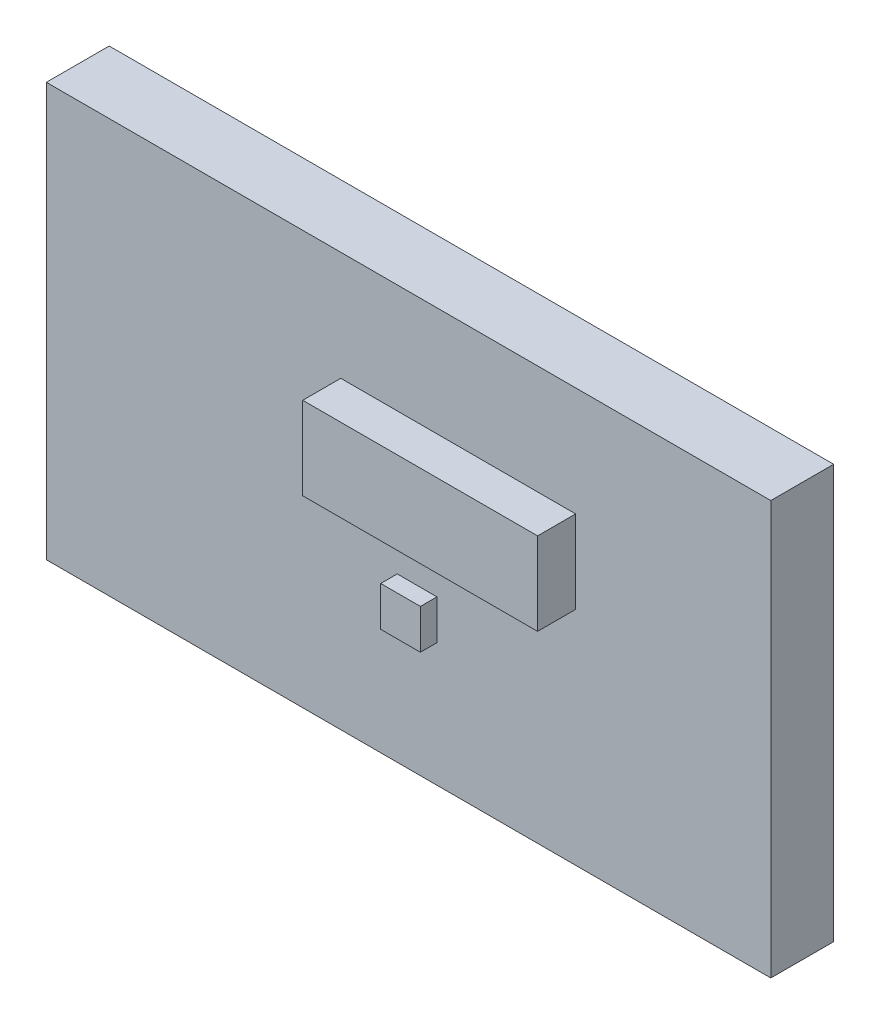
ISO-10303-21;
HEADER;
FILE_DESCRIPTION(('STEP AP214'),'2;1');
FILE_NAME('part.step','',(''),(''),'','','');
FILE_SCHEMA(('AUTOMOTIVE_DESIGN { 1 0 10303 214 1 1 1 1 }'));
ENDSEC;
DATA;
#1=APPLICATION_CONTEXT('core data for automotive mechanical design processes');
#2=APPLICATION_PROTOCOL_DEFINITION('international standard','automotive_design',2000,#1);
#3=PRODUCT_CONTEXT('',#1,'mechanical');
#4=PRODUCT('Part','Part','',(#3));
#5=PRODUCT_RELATED_PRODUCT_CATEGORY('part','',(#4));
#6=PRODUCT_DEFINITION_FORMATION('','',#4);
#7=PRODUCT_DEFINITION_CONTEXT('part definition',#1,'design');
#8=PRODUCT_DEFINITION('design','',#6,#7);
#9=PRODUCT_DEFINITION_SHAPE('','',#8);
#10=(LENGTH_UNIT() NAMED_UNIT(*) SI_UNIT(.MILLI.,.METRE.));
#11=(NAMED_UNIT(*) PLANE_ANGLE_UNIT() SI_UNIT($,.RADIAN.));
#12=(NAMED_UNIT(*) SI_UNIT($,.STERADIAN.) SOLID_ANGLE_UNIT());
#13=UNCERTAINTY_MEASURE_WITH_UNIT(LENGTH_MEASURE(1.E-05),#10,'distance_accuracy_value','');
#14=(GEOMETRIC_REPRESENTATION_CONTEXT(3) GLOBAL_UNCERTAINTY_ASSIGNED_CONTEXT((#13)) GLOBAL_UNIT_ASSIGNED_CONTEXT((#10,
#11,#12)) REPRESENTATION_CONTEXT('',''));
#15=CARTESIAN_POINT('',(0.,0.,0.));
#16=DIRECTION('',(0.,0.,1.));
#17=DIRECTION('',(1.,0.,0.));
#18=AXIS2_PLACEMENT_3D('',#15,#16,#17);
#19=CARTESIAN_POINT('',(0.,0.,19.));
#20=DIRECTION('',(0.,0.,-1.));
#21=DIRECTION('',(-1.,0.,0.));
#22=AXIS2_PLACEMENT_3D('',#19,#20,#21);
#23=PLANE('',#22);
#24=DIRECTION('',(0.,-1.,0.));
#25=VECTOR('',#24,1.);
#26=CARTESIAN_POINT('',(89.,92.,19.));
#27=LINE('',#26,#25);
#28=CARTESIAN_POINT('',(89.,92.,19.));
#29=VERTEX_POINT('',#28);
#30=CARTESIAN_POINT('',(89.,67.,19.));
#31=VERTEX_POINT('',#30);
#32=EDGE_CURVE('E144',#29,#31,#27,.T.);
#33=ORIENTED_EDGE('',*,*,#32,.F.);
#34=DIRECTION('',(-1.,0.,0.));
#35=VECTOR('',#34,1.);
#36=CARTESIAN_POINT('',(89.,92.,19.));
#37=LINE('',#36,#35);
#38=CARTESIAN_POINT('',(160.,92.,19.));
#39=VERTEX_POINT('',#38);
#40=EDGE_CURVE('E157',#39,#29,#37,.T.);
#41=ORIENTED_EDGE('',*,*,#40,.F.);
#42=DIRECTION('',(0.,1.,0.));
#43=VECTOR('',#42,1.);
#44=CARTESIAN_POINT('',(160.,92.,19.));
#45=LINE('',#44,#43);
#46=CARTESIAN_POINT('',(160.,67.,19.));
#47=VERTEX_POINT('',#46);
#48=EDGE_CURVE('E166',#47,#39,#45,.T.);
#49=ORIENTED_EDGE('',*,*,#48,.F.);
#50=DIRECTION('',(1.,0.,0.));
#51=VECTOR('',#50,1.);
#52=CARTESIAN_POINT('',(89.,67.,19.));
#53=LINE('',#52,#51);
#54=EDGE_CURVE('E147',#31,#47,#53,.T.);
#55=ORIENTED_EDGE('',*,*,#54,.F.);
#56=EDGE_LOOP('',(#33,#41,#49,#55));
#57=FACE_BOUND('',#56,.T.);
#58=DIRECTION('',(0.,1.,0.));
#59=VECTOR('',#58,1.);
#60=CARTESIAN_POINT('',(0.,0.,19.));
#61=LINE('',#60,#59);
#62=CARTESIAN_POINT('',(0.,0.,19.));
#63=VERTEX_POINT('',#62);
#64=CARTESIAN_POINT('',(0.,125.,19.));
#65=VERTEX_POINT('',#64);
#66=EDGE_CURVE('E183',#63,#65,#61,.T.);
#67=ORIENTED_EDGE('',*,*,#66,.F.);
#68=DIRECTION('',(1.,0.,0.));
#69=VECTOR('',#68,1.);
#70=CARTESIAN_POINT('',(0.,0.,19.));
#71=LINE('',#70,#69);
#72=CARTESIAN_POINT('',(219.,0.,19.));
#73=VERTEX_POINT('',#72);
#74=EDGE_CURVE('E192',#63,#73,#71,.T.);
#75=ORIENTED_EDGE('',*,*,#74,.T.);
#76=DIRECTION('',(0.,1.,0.));
#77=VECTOR('',#76,1.);
#78=CARTESIAN_POINT('',(219.,0.,19.));
#79=LINE('',#78,#77);
#80=CARTESIAN_POINT('',(219.,125.,19.));
#81=VERTEX_POINT('',#80);
#82=EDGE_CURVE('E190',#73,#81,#79,.T.);
#83=ORIENTED_EDGE('',*,*,#82,.T.);
#84=DIRECTION('',(1.,0.,0.));
#85=VECTOR('',#84,1.);
#86=CARTESIAN_POINT('',(0.,125.,19.));
#87=LINE('',#86,#85);
#88=EDGE_CURVE('E186',#65,#81,#87,.T.);
#89=ORIENTED_EDGE('',*,*,#88,.F.);
#90=EDGE_LOOP('',(#67,#75,#83,#89));
#91=FACE_BOUND('',#90,.T.);
#92=DIRECTION('',(0.,-1.,0.));
#93=VECTOR('',#92,1.);
#94=CARTESIAN_POINT('',(106.073348209962,49.3221229364321,19.));
#95=LINE('',#94,#93);
#96=CARTESIAN_POINT('',(106.073348209962,49.3221229364321,19.));
#97=VERTEX_POINT('',#96);
#98=CARTESIAN_POINT('',(106.073348209962,37.3221229364321,19.));
#99=VERTEX_POINT('',#98);
#100=EDGE_CURVE('E143',#97,#99,#95,.T.);
#101=ORIENTED_EDGE('',*,*,#100,.F.);
#102=DIRECTION('',(-1.,0.,0.));
#103=VECTOR('',#102,1.);
#104=CARTESIAN_POINT('',(106.073348209962,49.3221229364321,19.));
#105=LINE('',#104,#103);
#106=CARTESIAN_POINT('',(118.073348209962,49.3221229364321,19.));
#107=VERTEX_POINT('',#106);
#108=EDGE_CURVE('E140',#107,#97,#105,.T.);
#109=ORIENTED_EDGE('',*,*,#108,.F.);
#110=DIRECTION('',(0.,1.,0.));
#111=VECTOR('',#110,1.);
#112=CARTESIAN_POINT('',(118.073348209962,49.3221229364321,19.));
#113=LINE('',#112,#111);
#114=CARTESIAN_POINT('',(118.073348209962,37.3221229364321,19.));
#115=VERTEX_POINT('',#114);
#116=EDGE_CURVE('E55',#115,#107,#113,.T.);
#117=ORIENTED_EDGE('',*,*,#116,.F.);
#118=DIRECTION('',(1.,0.,0.));
#119=VECTOR('',#118,1.);
#120=CARTESIAN_POINT('',(106.073348209962,37.3221229364321,19.));
#121=LINE('',#120,#119);
#122=EDGE_CURVE('E50',#99,#115,#121,.T.);
#123=ORIENTED_EDGE('',*,*,#122,.F.);
#124=EDGE_LOOP('',(#101,#109,#117,#123));
#125=FACE_BOUND('',#124,.T.);
#126=ADVANCED_FACE('F33',(#57,#91,#125),#23,.F.);
#127=CARTESIAN_POINT('',(0.,0.,19.));
#128=DIRECTION('',(-1.,0.,0.));
#129=DIRECTION('',(0.,0.,1.));
#130=AXIS2_PLACEMENT_3D('',#127,#128,#129);
#131=PLANE('',#130);
#132=DIRECTION('',(0.,1.,0.));
#133=VECTOR('',#132,1.);
#134=CARTESIAN_POINT('',(0.,0.,0.));
#135=LINE('',#134,#133);
#136=CARTESIAN_POINT('',(0.,0.,0.));
#137=VERTEX_POINT('',#136);
#138=CARTESIAN_POINT('',(0.,125.,0.));
#139=VERTEX_POINT('',#138);
#140=EDGE_CURVE('E182',#137,#139,#135,.T.);
#141=ORIENTED_EDGE('',*,*,#140,.F.);
#142=DIRECTION('',(0.,0.,-1.));
#143=VECTOR('',#142,1.);
#144=CARTESIAN_POINT('',(0.,0.,19.));
#145=LINE('',#144,#143);
#146=EDGE_CURVE('E11',#63,#137,#145,.T.);
#147=ORIENTED_EDGE('',*,*,#146,.F.);
#148=ORIENTED_EDGE('',*,*,#66,.T.);
#149=DIRECTION('',(0.,0.,-1.));
#150=VECTOR('',#149,1.);
#151=CARTESIAN_POINT('',(0.,125.,19.));
#152=LINE('',#151,#150);
#153=EDGE_CURVE('E37',#65,#139,#152,.T.);
#154=ORIENTED_EDGE('',*,*,#153,.T.);
#155=EDGE_LOOP('',(#141,#147,#148,#154));
#156=FACE_BOUND('',#155,.T.);
#157=ADVANCED_FACE('F35',(#156),#131,.T.);
#158=CARTESIAN_POINT('',(0.,0.,19.));
#159=DIRECTION('',(0.,1.,0.));
#160=DIRECTION('',(0.,0.,1.));
#161=AXIS2_PLACEMENT_3D('',#158,#159,#160);
#162=PLANE('',#161);
#163=DIRECTION('',(1.,0.,0.));
#164=VECTOR('',#163,1.);
#165=CARTESIAN_POINT('',(0.,0.,0.));
#166=LINE('',#165,#164);
#167=CARTESIAN_POINT('',(219.,0.,0.));
#168=VERTEX_POINT('',#167);
#169=EDGE_CURVE('E187',#137,#168,#166,.T.);
#170=ORIENTED_EDGE('',*,*,#169,.T.);
#171=DIRECTION('',(0.,0.,-1.));
#172=VECTOR('',#171,1.);
#173=CARTESIAN_POINT('',(219.,0.,19.));
#174=LINE('',#173,#172);
#175=EDGE_CURVE('E42',#73,#168,#174,.T.);
#176=ORIENTED_EDGE('',*,*,#175,.F.);
#177=ORIENTED_EDGE('',*,*,#74,.F.);
#178=ORIENTED_EDGE('',*,*,#146,.T.);
#179=EDGE_LOOP('',(#170,#176,#177,#178));
#180=FACE_BOUND('',#179,.T.);
#181=ADVANCED_FACE('F219',(#180),#162,.F.);
#182=CARTESIAN_POINT('',(219.,0.,19.));
#183=DIRECTION('',(-1.,0.,0.));
#184=DIRECTION('',(0.,0.,1.));
#185=AXIS2_PLACEMENT_3D('',#182,#183,#184);
#186=PLANE('',#185);
#187=DIRECTION('',(0.,1.,0.));
#188=VECTOR('',#187,1.);
#189=CARTESIAN_POINT('',(219.,0.,0.));
#190=LINE('',#189,#188);
#191=CARTESIAN_POINT('',(219.,125.,0.));
#192=VERTEX_POINT('',#191);
#193=EDGE_CURVE('E199',#168,#192,#190,.T.);
#194=ORIENTED_EDGE('',*,*,#193,.T.);
#195=DIRECTION('',(0.,0.,-1.));
#196=VECTOR('',#195,1.);
#197=CARTESIAN_POINT('',(219.,125.,19.));
#198=LINE('',#197,#196);
#199=EDGE_CURVE('E204',#81,#192,#198,.T.);
#200=ORIENTED_EDGE('',*,*,#199,.F.);
#201=ORIENTED_EDGE('',*,*,#82,.F.);
#202=ORIENTED_EDGE('',*,*,#175,.T.);
#203=EDGE_LOOP('',(#194,#200,#201,#202));
#204=FACE_BOUND('',#203,.T.);
#205=ADVANCED_FACE('F223',(#204),#186,.F.);
#206=CARTESIAN_POINT('',(0.,125.,19.));
#207=DIRECTION('',(0.,1.,0.));
#208=DIRECTION('',(0.,0.,1.));
#209=AXIS2_PLACEMENT_3D('',#206,#207,#208);
#210=PLANE('',#209);
#211=DIRECTION('',(1.,0.,0.));
#212=VECTOR('',#211,1.);
#213=CARTESIAN_POINT('',(0.,125.,0.));
#214=LINE('',#213,#212);
#215=EDGE_CURVE('E196',#139,#192,#214,.T.);
#216=ORIENTED_EDGE('',*,*,#215,.F.);
#217=ORIENTED_EDGE('',*,*,#153,.F.);
#218=ORIENTED_EDGE('',*,*,#88,.T.);
#219=ORIENTED_EDGE('',*,*,#199,.T.);
#220=EDGE_LOOP('',(#216,#217,#218,#219));
#221=FACE_BOUND('',#220,.T.);
#222=ADVANCED_FACE('F212',(#221),#210,.T.);
#223=CARTESIAN_POINT('',(0.,0.,0.));
#224=DIRECTION('',(0.,0.,-1.));
#225=DIRECTION('',(-1.,0.,0.));
#226=AXIS2_PLACEMENT_3D('',#223,#224,#225);
#227=PLANE('',#226);
#228=ORIENTED_EDGE('',*,*,#140,.T.);
#229=ORIENTED_EDGE('',*,*,#215,.T.);
#230=ORIENTED_EDGE('',*,*,#193,.F.);
#231=ORIENTED_EDGE('',*,*,#169,.F.);
#232=EDGE_LOOP('',(#228,#229,#230,#231));
#233=FACE_BOUND('',#232,.T.);
#234=ADVANCED_FACE('F216',(#233),#227,.T.);
#235=CARTESIAN_POINT('',(89.,92.,30.5));
#236=DIRECTION('',(1.,0.,0.));
#237=DIRECTION('',(0.,0.,-1.));
#238=AXIS2_PLACEMENT_3D('',#235,#236,#237);
#239=PLANE('',#238);
#240=ORIENTED_EDGE('',*,*,#32,.T.);
#241=DIRECTION('',(0.,0.,-1.));
#242=VECTOR('',#241,1.);
#243=CARTESIAN_POINT('',(89.,67.,30.5));
#244=LINE('',#243,#242);
#245=CARTESIAN_POINT('',(89.,67.,30.5));
#246=VERTEX_POINT('',#245);
#247=EDGE_CURVE('E179',#246,#31,#244,.T.);
#248=ORIENTED_EDGE('',*,*,#247,.F.);
#249=DIRECTION('',(0.,-1.,0.));
#250=VECTOR('',#249,1.);
#251=CARTESIAN_POINT('',(89.,92.,30.5));
#252=LINE('',#251,#250);
#253=CARTESIAN_POINT('',(89.,92.,30.5));
#254=VERTEX_POINT('',#253);
#255=EDGE_CURVE('E153',#254,#246,#252,.T.);
#256=ORIENTED_EDGE('',*,*,#255,.F.);
#257=DIRECTION('',(0.,0.,-1.));
#258=VECTOR('',#257,1.);
#259=CARTESIAN_POINT('',(89.,92.,30.5));
#260=LINE('',#259,#258);
#261=EDGE_CURVE('E162',#254,#29,#260,.T.);
#262=ORIENTED_EDGE('',*,*,#261,.T.);
#263=EDGE_LOOP('',(#240,#248,#256,#262));
#264=FACE_BOUND('',#263,.T.);
#265=ADVANCED_FACE('F270',(#264),#239,.F.);
#266=CARTESIAN_POINT('',(89.,67.,30.5));
#267=DIRECTION('',(0.,1.,0.));
#268=DIRECTION('',(0.,0.,1.));
#269=AXIS2_PLACEMENT_3D('',#266,#267,#268);
#270=PLANE('',#269);
#271=ORIENTED_EDGE('',*,*,#54,.T.);
#272=DIRECTION('',(0.,0.,-1.));
#273=VECTOR('',#272,1.);
#274=CARTESIAN_POINT('',(160.,67.,30.5));
#275=LINE('',#274,#273);
#276=CARTESIAN_POINT('',(160.,67.,30.5));
#277=VERTEX_POINT('',#276);
#278=EDGE_CURVE('E176',#277,#47,#275,.T.);
#279=ORIENTED_EDGE('',*,*,#278,.F.);
#280=DIRECTION('',(1.,0.,0.));
#281=VECTOR('',#280,1.);
#282=CARTESIAN_POINT('',(89.,67.,30.5));
#283=LINE('',#282,#281);
#284=EDGE_CURVE('E156',#246,#277,#283,.T.);
#285=ORIENTED_EDGE('',*,*,#284,.F.);
#286=ORIENTED_EDGE('',*,*,#247,.T.);
#287=EDGE_LOOP('',(#271,#279,#285,#286));
#288=FACE_BOUND('',#287,.T.);
#289=ADVANCED_FACE('F266',(#288),#270,.F.);
#290=CARTESIAN_POINT('',(160.,92.,30.5));
#291=DIRECTION('',(-1.,0.,0.));
#292=DIRECTION('',(0.,0.,1.));
#293=AXIS2_PLACEMENT_3D('',#290,#291,#292);
#294=PLANE('',#293);
#295=ORIENTED_EDGE('',*,*,#48,.T.);
#296=DIRECTION('',(0.,0.,-1.));
#297=VECTOR('',#296,1.);
#298=CARTESIAN_POINT('',(160.,92.,30.5));
#299=LINE('',#298,#297);
#300=CARTESIAN_POINT('',(160.,92.,30.5));
#301=VERTEX_POINT('',#300);
#302=EDGE_CURVE('E173',#301,#39,#299,.T.);
#303=ORIENTED_EDGE('',*,*,#302,.F.);
#304=DIRECTION('',(0.,1.,0.));
#305=VECTOR('',#304,1.);
#306=CARTESIAN_POINT('',(160.,92.,30.5));
#307=LINE('',#306,#305);
#308=EDGE_CURVE('E159',#277,#301,#307,.T.);
#309=ORIENTED_EDGE('',*,*,#308,.F.);
#310=ORIENTED_EDGE('',*,*,#278,.T.);
#311=EDGE_LOOP('',(#295,#303,#309,#310));
#312=FACE_BOUND('',#311,.T.);
#313=ADVANCED_FACE('F262',(#312),#294,.F.);
#314=CARTESIAN_POINT('',(89.,92.,30.5));
#315=DIRECTION('',(0.,-1.,0.));
#316=DIRECTION('',(0.,0.,-1.));
#317=AXIS2_PLACEMENT_3D('',#314,#315,#316);
#318=PLANE('',#317);
#319=ORIENTED_EDGE('',*,*,#40,.T.);
#320=ORIENTED_EDGE('',*,*,#261,.F.);
#321=DIRECTION('',(-1.,0.,0.));
#322=VECTOR('',#321,1.);
#323=CARTESIAN_POINT('',(89.,92.,30.5));
#324=LINE('',#323,#322);
#325=EDGE_CURVE('E161',#301,#254,#324,.T.);
#326=ORIENTED_EDGE('',*,*,#325,.F.);
#327=ORIENTED_EDGE('',*,*,#302,.T.);
#328=EDGE_LOOP('',(#319,#320,#326,#327));
#329=FACE_BOUND('',#328,.T.);
#330=ADVANCED_FACE('F258',(#329),#318,.F.);
#331=CARTESIAN_POINT('',(0.,0.,30.5));
#332=DIRECTION('',(0.,0.,1.));
#333=DIRECTION('',(1.,0.,0.));
#334=AXIS2_PLACEMENT_3D('',#331,#332,#333);
#335=PLANE('',#334);
#336=ORIENTED_EDGE('',*,*,#255,.T.);
#337=ORIENTED_EDGE('',*,*,#284,.T.);
#338=ORIENTED_EDGE('',*,*,#308,.T.);
#339=ORIENTED_EDGE('',*,*,#325,.T.);
#340=EDGE_LOOP('',(#336,#337,#338,#339));
#341=FACE_BOUND('',#340,.T.);
#342=ADVANCED_FACE('F255',(#341),#335,.T.);
#343=CARTESIAN_POINT('',(106.073348209962,49.3221229364321,24.));
#344=DIRECTION('',(1.,0.,0.));
#345=DIRECTION('',(0.,0.,-1.));
#346=AXIS2_PLACEMENT_3D('',#343,#344,#345);
#347=PLANE('',#346);
#348=ORIENTED_EDGE('',*,*,#100,.T.);
#349=DIRECTION('',(0.,0.,-1.));
#350=VECTOR('',#349,1.);
#351=CARTESIAN_POINT('',(106.073348209962,37.3221229364321,24.));
#352=LINE('',#351,#350);
#353=CARTESIAN_POINT('',(106.073348209962,37.3221229364321,24.));
#354=VERTEX_POINT('',#353);
#355=EDGE_CURVE('E124',#354,#99,#352,.T.);
#356=ORIENTED_EDGE('',*,*,#355,.F.);
#357=DIRECTION('',(0.,-1.,0.));
#358=VECTOR('',#357,1.);
#359=CARTESIAN_POINT('',(106.073348209962,49.3221229364321,24.));
#360=LINE('',#359,#358);
#361=CARTESIAN_POINT('',(106.073348209962,49.3221229364321,24.));
#362=VERTEX_POINT('',#361);
#363=EDGE_CURVE('E131',#362,#354,#360,.T.);
#364=ORIENTED_EDGE('',*,*,#363,.F.);
#365=DIRECTION('',(0.,0.,-1.));
#366=VECTOR('',#365,1.);
#367=CARTESIAN_POINT('',(106.073348209962,49.3221229364321,24.));
#368=LINE('',#367,#366);
#369=EDGE_CURVE('E233',#362,#97,#368,.T.);
#370=ORIENTED_EDGE('',*,*,#369,.T.);
#371=EDGE_LOOP('',(#348,#356,#364,#370));
#372=FACE_BOUND('',#371,.T.);
#373=ADVANCED_FACE('F142',(#372),#347,.F.);
#374=CARTESIAN_POINT('',(106.073348209962,37.3221229364321,24.));
#375=DIRECTION('',(0.,1.,0.));
#376=DIRECTION('',(0.,0.,1.));
#377=AXIS2_PLACEMENT_3D('',#374,#375,#376);
#378=PLANE('',#377);
#379=ORIENTED_EDGE('',*,*,#122,.T.);
#380=DIRECTION('',(0.,0.,-1.));
#381=VECTOR('',#380,1.);
#382=CARTESIAN_POINT('',(118.073348209962,37.3221229364321,24.));
#383=LINE('',#382,#381);
#384=CARTESIAN_POINT('',(118.073348209962,37.3221229364321,24.));
#385=VERTEX_POINT('',#384);
#386=EDGE_CURVE('E127',#385,#115,#383,.T.);
#387=ORIENTED_EDGE('',*,*,#386,.F.);
#388=DIRECTION('',(1.,0.,0.));
#389=VECTOR('',#388,1.);
#390=CARTESIAN_POINT('',(106.073348209962,37.3221229364321,24.));
#391=LINE('',#390,#389);
#392=EDGE_CURVE('E120',#354,#385,#391,.T.);
#393=ORIENTED_EDGE('',*,*,#392,.F.);
#394=ORIENTED_EDGE('',*,*,#355,.T.);
#395=EDGE_LOOP('',(#379,#387,#393,#394));
#396=FACE_BOUND('',#395,.T.);
#397=ADVANCED_FACE('F122',(#396),#378,.F.);
#398=CARTESIAN_POINT('',(118.073348209962,49.3221229364321,24.));
#399=DIRECTION('',(-1.,0.,0.));
#400=DIRECTION('',(0.,0.,1.));
#401=AXIS2_PLACEMENT_3D('',#398,#399,#400);
#402=PLANE('',#401);
#403=ORIENTED_EDGE('',*,*,#116,.T.);
#404=DIRECTION('',(0.,0.,-1.));
#405=VECTOR('',#404,1.);
#406=CARTESIAN_POINT('',(118.073348209962,49.3221229364321,24.));
#407=LINE('',#406,#405);
#408=CARTESIAN_POINT('',(118.073348209962,49.3221229364321,24.));
#409=VERTEX_POINT('',#408);
#410=EDGE_CURVE('E149',#409,#107,#407,.T.);
#411=ORIENTED_EDGE('',*,*,#410,.F.);
#412=DIRECTION('',(0.,1.,0.));
#413=VECTOR('',#412,1.);
#414=CARTESIAN_POINT('',(118.073348209962,49.3221229364321,24.));
#415=LINE('',#414,#413);
#416=EDGE_CURVE('E130',#385,#409,#415,.T.);
#417=ORIENTED_EDGE('',*,*,#416,.F.);
#418=ORIENTED_EDGE('',*,*,#386,.T.);
#419=EDGE_LOOP('',(#403,#411,#417,#418));
#420=FACE_BOUND('',#419,.T.);
#421=ADVANCED_FACE('F242',(#420),#402,.F.);
#422=CARTESIAN_POINT('',(106.073348209962,49.3221229364321,24.));
#423=DIRECTION('',(0.,-1.,0.));
#424=DIRECTION('',(0.,0.,-1.));
#425=AXIS2_PLACEMENT_3D('',#422,#423,#424);
#426=PLANE('',#425);
#427=ORIENTED_EDGE('',*,*,#108,.T.);
#428=ORIENTED_EDGE('',*,*,#369,.F.);
#429=DIRECTION('',(-1.,0.,0.));
#430=VECTOR('',#429,1.);
#431=CARTESIAN_POINT('',(106.073348209962,49.3221229364321,24.));
#432=LINE('',#431,#430);
#433=EDGE_CURVE('E136',#409,#362,#432,.T.);
#434=ORIENTED_EDGE('',*,*,#433,.F.);
#435=ORIENTED_EDGE('',*,*,#410,.T.);
#436=EDGE_LOOP('',(#427,#428,#434,#435));
#437=FACE_BOUND('',#436,.T.);
#438=ADVANCED_FACE('F232',(#437),#426,.F.);
#439=CARTESIAN_POINT('',(0.,0.,24.));
#440=DIRECTION('',(0.,0.,1.));
#441=DIRECTION('',(1.,0.,0.));
#442=AXIS2_PLACEMENT_3D('',#439,#440,#441);
#443=PLANE('',#442);
#444=ORIENTED_EDGE('',*,*,#363,.T.);
#445=ORIENTED_EDGE('',*,*,#392,.T.);
#446=ORIENTED_EDGE('',*,*,#416,.T.);
#447=ORIENTED_EDGE('',*,*,#433,.T.);
#448=EDGE_LOOP('',(#444,#445,#446,#447));
#449=FACE_BOUND('',#448,.T.);
#450=ADVANCED_FACE('F134',(#449),#443,.T.);
#451=CLOSED_SHELL('',(#126,#157,#181,#205,#222,#234,#265,#289,#313,#330,#342,#373,#397,#421,
#438,#450));
#452=MANIFOLD_SOLID_BREP('B2',#451);
#453=ADVANCED_BREP_SHAPE_REPRESENTATION('',(#18,#452),#14);
#454=SHAPE_DEFINITION_REPRESENTATION(#9,#453);
ENDSEC;
END-ISO-10303-21;
